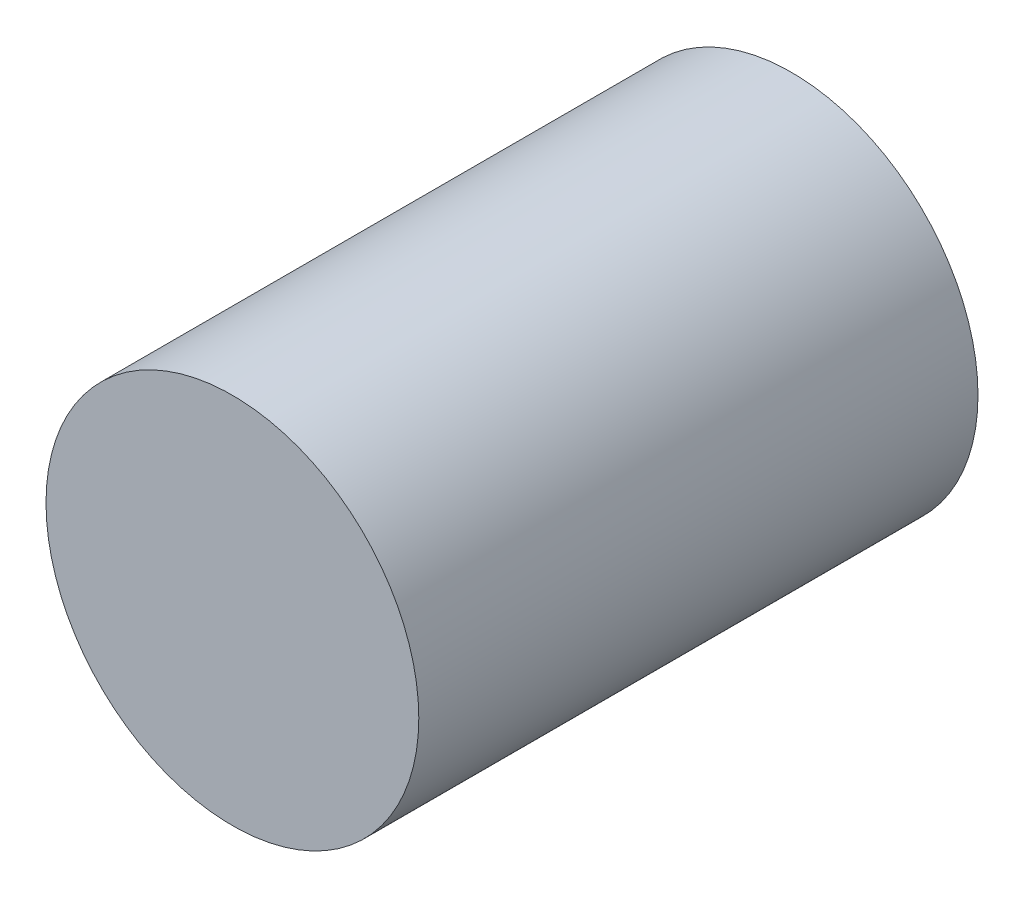
ISO-10303-21;
HEADER;
FILE_DESCRIPTION(('STEP AP214'),'2;1');
FILE_NAME('part.step','',(''),(''),'','','');
FILE_SCHEMA(('AUTOMOTIVE_DESIGN { 1 0 10303 214 1 1 1 1 }'));
ENDSEC;
DATA;
#1=APPLICATION_CONTEXT('core data for automotive mechanical design processes');
#2=APPLICATION_PROTOCOL_DEFINITION('international standard','automotive_design',2000,#1);
#3=PRODUCT_CONTEXT('',#1,'mechanical');
#4=PRODUCT('Part','Part','',(#3));
#5=PRODUCT_RELATED_PRODUCT_CATEGORY('part','',(#4));
#6=PRODUCT_DEFINITION_FORMATION('','',#4);
#7=PRODUCT_DEFINITION_CONTEXT('part definition',#1,'design');
#8=PRODUCT_DEFINITION('design','',#6,#7);
#9=PRODUCT_DEFINITION_SHAPE('','',#8);
#10=(LENGTH_UNIT() NAMED_UNIT(*) SI_UNIT(.MILLI.,.METRE.));
#11=(NAMED_UNIT(*) PLANE_ANGLE_UNIT() SI_UNIT($,.RADIAN.));
#12=(NAMED_UNIT(*) SI_UNIT($,.STERADIAN.) SOLID_ANGLE_UNIT());
#13=UNCERTAINTY_MEASURE_WITH_UNIT(LENGTH_MEASURE(1.E-05),#10,'distance_accuracy_value','');
#14=(GEOMETRIC_REPRESENTATION_CONTEXT(3) GLOBAL_UNCERTAINTY_ASSIGNED_CONTEXT((#13)) GLOBAL_UNIT_ASSIGNED_CONTEXT((#10,
#11,#12)) REPRESENTATION_CONTEXT('',''));
#15=CARTESIAN_POINT('',(0.,0.,0.));
#16=DIRECTION('',(0.,0.,1.));
#17=DIRECTION('',(1.,0.,0.));
#18=AXIS2_PLACEMENT_3D('',#15,#16,#17);
#19=CARTESIAN_POINT('',(0.,0.,30.));
#20=DIRECTION('',(0.,0.,-1.));
#21=DIRECTION('',(-1.,0.,0.));
#22=AXIS2_PLACEMENT_3D('',#19,#20,#21);
#23=CYLINDRICAL_SURFACE('',#22,10.);
#24=CARTESIAN_POINT('',(0.,0.,30.));
#25=DIRECTION('',(0.,0.,1.));
#26=DIRECTION('',(1.,0.,0.));
#27=AXIS2_PLACEMENT_3D('',#24,#25,#26);
#28=CIRCLE('',#27,10.);
#29=CARTESIAN_POINT('',(10.,0.,30.));
#30=VERTEX_POINT('',#29);
#31=EDGE_CURVE('E10',#30,#30,#28,.T.);
#32=ORIENTED_EDGE('',*,*,#31,.F.);
#33=EDGE_LOOP('',(#32));
#34=FACE_BOUND('',#33,.T.);
#35=CARTESIAN_POINT('',(0.,0.,0.));
#36=DIRECTION('',(0.,0.,1.));
#37=DIRECTION('',(1.,0.,0.));
#38=AXIS2_PLACEMENT_3D('',#35,#36,#37);
#39=CIRCLE('',#38,10.);
#40=CARTESIAN_POINT('',(10.,0.,0.));
#41=VERTEX_POINT('',#40);
#42=EDGE_CURVE('E35',#41,#41,#39,.T.);
#43=ORIENTED_EDGE('',*,*,#42,.T.);
#44=EDGE_LOOP('',(#43));
#45=FACE_BOUND('',#44,.T.);
#46=ADVANCED_FACE('F32',(#34,#45),#23,.T.);
#47=CARTESIAN_POINT('',(0.,0.,30.));
#48=DIRECTION('',(0.,0.,1.));
#49=DIRECTION('',(1.,0.,0.));
#50=AXIS2_PLACEMENT_3D('',#47,#48,#49);
#51=PLANE('',#50);
#52=ORIENTED_EDGE('',*,*,#31,.T.);
#53=EDGE_LOOP('',(#52));
#54=FACE_BOUND('',#53,.T.);
#55=ADVANCED_FACE('F47',(#54),#51,.T.);
#56=CARTESIAN_POINT('',(0.,0.,0.));
#57=DIRECTION('',(0.,0.,1.));
#58=DIRECTION('',(1.,0.,0.));
#59=AXIS2_PLACEMENT_3D('',#56,#57,#58);
#60=PLANE('',#59);
#61=ORIENTED_EDGE('',*,*,#42,.F.);
#62=EDGE_LOOP('',(#61));
#63=FACE_BOUND('',#62,.T.);
#64=ADVANCED_FACE('F45',(#63),#60,.F.);
#65=CLOSED_SHELL('',(#46,#55,#64));
#66=MANIFOLD_SOLID_BREP('B2',#65);
#67=ADVANCED_BREP_SHAPE_REPRESENTATION('',(#18,#66),#14);
#68=SHAPE_DEFINITION_REPRESENTATION(#9,#67);
ENDSEC;
END-ISO-10303-21;
